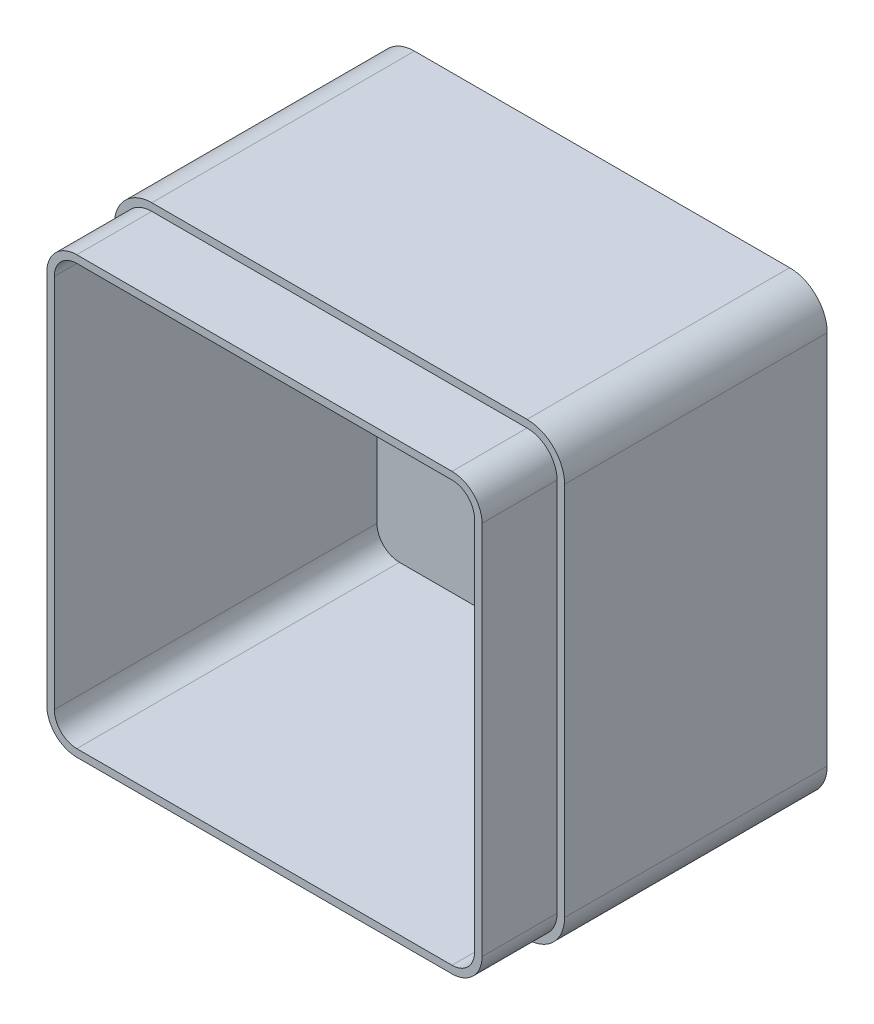
ISO-10303-21;
HEADER;
FILE_DESCRIPTION(('STEP AP214'),'2;1');
FILE_NAME('part.step','',(''),(''),'','','');
FILE_SCHEMA(('AUTOMOTIVE_DESIGN { 1 0 10303 214 1 1 1 1 }'));
ENDSEC;
DATA;
#1=APPLICATION_CONTEXT('core data for automotive mechanical design processes');
#2=APPLICATION_PROTOCOL_DEFINITION('international standard','automotive_design',2000,#1);
#3=PRODUCT_CONTEXT('',#1,'mechanical');
#4=PRODUCT('Part','Part','',(#3));
#5=PRODUCT_RELATED_PRODUCT_CATEGORY('part','',(#4));
#6=PRODUCT_DEFINITION_FORMATION('','',#4);
#7=PRODUCT_DEFINITION_CONTEXT('part definition',#1,'design');
#8=PRODUCT_DEFINITION('design','',#6,#7);
#9=PRODUCT_DEFINITION_SHAPE('','',#8);
#10=(LENGTH_UNIT() NAMED_UNIT(*) SI_UNIT(.MILLI.,.METRE.));
#11=(NAMED_UNIT(*) PLANE_ANGLE_UNIT() SI_UNIT($,.RADIAN.));
#12=(NAMED_UNIT(*) SI_UNIT($,.STERADIAN.) SOLID_ANGLE_UNIT());
#13=UNCERTAINTY_MEASURE_WITH_UNIT(LENGTH_MEASURE(1.E-05),#10,'distance_accuracy_value','');
#14=(GEOMETRIC_REPRESENTATION_CONTEXT(3) GLOBAL_UNCERTAINTY_ASSIGNED_CONTEXT((#13)) GLOBAL_UNIT_ASSIGNED_CONTEXT((#10,
#11,#12)) REPRESENTATION_CONTEXT('',''));
#15=CARTESIAN_POINT('',(0.,0.,0.));
#16=DIRECTION('',(0.,0.,1.));
#17=DIRECTION('',(1.,0.,0.));
#18=AXIS2_PLACEMENT_3D('',#15,#16,#17);
#19=CARTESIAN_POINT('',(0.,0.,90.));
#20=DIRECTION('',(0.,0.,1.));
#21=DIRECTION('',(1.,0.,0.));
#22=AXIS2_PLACEMENT_3D('',#19,#20,#21);
#23=PLANE('',#22);
#24=DIRECTION('',(0.,-1.,0.));
#25=VECTOR('',#24,1.);
#26=CARTESIAN_POINT('',(4.,0.,90.));
#27=LINE('',#26,#25);
#28=CARTESIAN_POINT('',(4.,-9.99999999999999,90.));
#29=VERTEX_POINT('',#28);
#30=CARTESIAN_POINT('',(4.,-110.,90.));
#31=VERTEX_POINT('',#30);
#32=EDGE_CURVE('E398',#29,#31,#27,.T.);
#33=ORIENTED_EDGE('',*,*,#32,.F.);
#34=CARTESIAN_POINT('',(10.,-10.,90.));
#35=DIRECTION('',(0.,0.,1.));
#36=DIRECTION('',(1.,0.,0.));
#37=AXIS2_PLACEMENT_3D('',#34,#35,#36);
#38=CIRCLE('',#37,6.);
#39=CARTESIAN_POINT('',(9.99999999999999,-4.,90.));
#40=VERTEX_POINT('',#39);
#41=EDGE_CURVE('E444',#40,#29,#38,.T.);
#42=ORIENTED_EDGE('',*,*,#41,.F.);
#43=DIRECTION('',(-1.,0.,0.));
#44=VECTOR('',#43,1.);
#45=CARTESIAN_POINT('',(0.,-4.,90.));
#46=LINE('',#45,#44);
#47=CARTESIAN_POINT('',(110.,-4.,90.));
#48=VERTEX_POINT('',#47);
#49=EDGE_CURVE('E413',#48,#40,#46,.T.);
#50=ORIENTED_EDGE('',*,*,#49,.F.);
#51=CARTESIAN_POINT('',(110.,-10.,90.));
#52=DIRECTION('',(0.,0.,1.));
#53=DIRECTION('',(1.,0.,0.));
#54=AXIS2_PLACEMENT_3D('',#51,#52,#53);
#55=CIRCLE('',#54,6.);
#56=CARTESIAN_POINT('',(116.,-10.,90.));
#57=VERTEX_POINT('',#56);
#58=EDGE_CURVE('E377',#57,#48,#55,.T.);
#59=ORIENTED_EDGE('',*,*,#58,.F.);
#60=DIRECTION('',(0.,1.,0.));
#61=VECTOR('',#60,1.);
#62=CARTESIAN_POINT('',(116.,0.,90.));
#63=LINE('',#62,#61);
#64=CARTESIAN_POINT('',(116.,-110.,90.));
#65=VERTEX_POINT('',#64);
#66=EDGE_CURVE('E441',#65,#57,#63,.T.);
#67=ORIENTED_EDGE('',*,*,#66,.F.);
#68=CARTESIAN_POINT('',(110.,-110.,90.));
#69=DIRECTION('',(0.,0.,1.));
#70=DIRECTION('',(1.,0.,0.));
#71=AXIS2_PLACEMENT_3D('',#68,#69,#70);
#72=CIRCLE('',#71,6.);
#73=CARTESIAN_POINT('',(110.,-116.,90.));
#74=VERTEX_POINT('',#73);
#75=EDGE_CURVE('E437',#74,#65,#72,.T.);
#76=ORIENTED_EDGE('',*,*,#75,.F.);
#77=DIRECTION('',(1.,0.,0.));
#78=VECTOR('',#77,1.);
#79=CARTESIAN_POINT('',(0.,-116.,90.));
#80=LINE('',#79,#78);
#81=CARTESIAN_POINT('',(9.99999999999999,-116.,90.));
#82=VERTEX_POINT('',#81);
#83=EDGE_CURVE('E434',#82,#74,#80,.T.);
#84=ORIENTED_EDGE('',*,*,#83,.F.);
#85=CARTESIAN_POINT('',(10.,-110.,90.));
#86=DIRECTION('',(0.,0.,1.));
#87=DIRECTION('',(1.,0.,0.));
#88=AXIS2_PLACEMENT_3D('',#85,#86,#87);
#89=CIRCLE('',#88,6.);
#90=EDGE_CURVE('E422',#31,#82,#89,.T.);
#91=ORIENTED_EDGE('',*,*,#90,.F.);
#92=EDGE_LOOP('',(#33,#42,#50,#59,#67,#76,#84,#91));
#93=FACE_BOUND('',#92,.T.);
#94=DIRECTION('',(-1.,0.,0.));
#95=VECTOR('',#94,1.);
#96=CARTESIAN_POINT('',(110.,-2.,90.));
#97=LINE('',#96,#95);
#98=CARTESIAN_POINT('',(110.,-2.,90.));
#99=VERTEX_POINT('',#98);
#100=CARTESIAN_POINT('',(9.99999999999999,-2.,90.));
#101=VERTEX_POINT('',#100);
#102=EDGE_CURVE('E278',#99,#101,#97,.T.);
#103=ORIENTED_EDGE('',*,*,#102,.T.);
#104=CARTESIAN_POINT('',(10.,-10.,90.));
#105=DIRECTION('',(0.,0.,1.));
#106=DIRECTION('',(1.,0.,0.));
#107=AXIS2_PLACEMENT_3D('',#104,#105,#106);
#108=CIRCLE('',#107,8.);
#109=CARTESIAN_POINT('',(2.,-9.99999999999999,90.));
#110=VERTEX_POINT('',#109);
#111=EDGE_CURVE('E305',#101,#110,#108,.T.);
#112=ORIENTED_EDGE('',*,*,#111,.T.);
#113=DIRECTION('',(0.,-1.,0.));
#114=VECTOR('',#113,1.);
#115=CARTESIAN_POINT('',(2.,-9.99999999999999,90.));
#116=LINE('',#115,#114);
#117=CARTESIAN_POINT('',(2.,-110.,90.));
#118=VERTEX_POINT('',#117);
#119=EDGE_CURVE('E255',#110,#118,#116,.T.);
#120=ORIENTED_EDGE('',*,*,#119,.T.);
#121=CARTESIAN_POINT('',(10.,-110.,90.));
#122=DIRECTION('',(0.,0.,1.));
#123=DIRECTION('',(1.,0.,0.));
#124=AXIS2_PLACEMENT_3D('',#121,#122,#123);
#125=CIRCLE('',#124,7.99999999999999);
#126=CARTESIAN_POINT('',(9.99999999999999,-118.,90.));
#127=VERTEX_POINT('',#126);
#128=EDGE_CURVE('E103',#118,#127,#125,.T.);
#129=ORIENTED_EDGE('',*,*,#128,.T.);
#130=DIRECTION('',(1.,0.,0.));
#131=VECTOR('',#130,1.);
#132=CARTESIAN_POINT('',(9.99999999999999,-118.,90.));
#133=LINE('',#132,#131);
#134=CARTESIAN_POINT('',(110.,-118.,90.));
#135=VERTEX_POINT('',#134);
#136=EDGE_CURVE('E312',#127,#135,#133,.T.);
#137=ORIENTED_EDGE('',*,*,#136,.T.);
#138=CARTESIAN_POINT('',(110.,-110.,90.));
#139=DIRECTION('',(0.,0.,1.));
#140=DIRECTION('',(1.,0.,0.));
#141=AXIS2_PLACEMENT_3D('',#138,#139,#140);
#142=CIRCLE('',#141,7.99999999999999);
#143=CARTESIAN_POINT('',(118.,-110.,90.));
#144=VERTEX_POINT('',#143);
#145=EDGE_CURVE('E316',#135,#144,#142,.T.);
#146=ORIENTED_EDGE('',*,*,#145,.T.);
#147=DIRECTION('',(0.,1.,0.));
#148=VECTOR('',#147,1.);
#149=CARTESIAN_POINT('',(118.,-110.,90.));
#150=LINE('',#149,#148);
#151=CARTESIAN_POINT('',(118.,-9.99999999999999,90.));
#152=VERTEX_POINT('',#151);
#153=EDGE_CURVE('E320',#144,#152,#150,.T.);
#154=ORIENTED_EDGE('',*,*,#153,.T.);
#155=CARTESIAN_POINT('',(110.,-10.,90.));
#156=DIRECTION('',(0.,0.,1.));
#157=DIRECTION('',(1.,0.,0.));
#158=AXIS2_PLACEMENT_3D('',#155,#156,#157);
#159=CIRCLE('',#158,8.);
#160=EDGE_CURVE('E282',#152,#99,#159,.T.);
#161=ORIENTED_EDGE('',*,*,#160,.T.);
#162=EDGE_LOOP('',(#103,#112,#120,#129,#137,#146,#154,#161));
#163=FACE_BOUND('',#162,.T.);
#164=ADVANCED_FACE('F87',(#93,#163),#23,.T.);
#165=CARTESIAN_POINT('',(4.,0.,90.));
#166=DIRECTION('',(1.,0.,0.));
#167=DIRECTION('',(0.,0.,-1.));
#168=AXIS2_PLACEMENT_3D('',#165,#166,#167);
#169=PLANE('',#168);
#170=DIRECTION('',(0.,-1.,0.));
#171=VECTOR('',#170,1.);
#172=CARTESIAN_POINT('',(4.,0.,4.));
#173=LINE('',#172,#171);
#174=CARTESIAN_POINT('',(4.,-9.99999999999999,4.));
#175=VERTEX_POINT('',#174);
#176=CARTESIAN_POINT('',(4.,-110.,4.));
#177=VERTEX_POINT('',#176);
#178=EDGE_CURVE('E369',#175,#177,#173,.T.);
#179=ORIENTED_EDGE('',*,*,#178,.F.);
#180=DIRECTION('',(0.,0.,-1.));
#181=VECTOR('',#180,1.);
#182=CARTESIAN_POINT('',(4.,-9.99999999999999,90.));
#183=LINE('',#182,#181);
#184=EDGE_CURVE('E378',#29,#175,#183,.T.);
#185=ORIENTED_EDGE('',*,*,#184,.F.);
#186=ORIENTED_EDGE('',*,*,#32,.T.);
#187=DIRECTION('',(0.,0.,-1.));
#188=VECTOR('',#187,1.);
#189=CARTESIAN_POINT('',(4.,-110.,90.));
#190=LINE('',#189,#188);
#191=EDGE_CURVE('E374',#177,#31,#190,.F.);
#192=ORIENTED_EDGE('',*,*,#191,.F.);
#193=EDGE_LOOP('',(#179,#185,#186,#192));
#194=FACE_BOUND('',#193,.T.);
#195=ADVANCED_FACE('F552',(#194),#169,.T.);
#196=CARTESIAN_POINT('',(0.,-116.,90.));
#197=DIRECTION('',(0.,1.,0.));
#198=DIRECTION('',(-1.,0.,0.));
#199=AXIS2_PLACEMENT_3D('',#196,#197,#198);
#200=PLANE('',#199);
#201=ORIENTED_EDGE('',*,*,#83,.T.);
#202=DIRECTION('',(0.,0.,1.));
#203=VECTOR('',#202,1.);
#204=CARTESIAN_POINT('',(110.,-116.,90.));
#205=LINE('',#204,#203);
#206=CARTESIAN_POINT('',(110.,-116.,4.));
#207=VERTEX_POINT('',#206);
#208=EDGE_CURVE('E410',#207,#74,#205,.T.);
#209=ORIENTED_EDGE('',*,*,#208,.F.);
#210=DIRECTION('',(1.,0.,0.));
#211=VECTOR('',#210,1.);
#212=CARTESIAN_POINT('',(0.,-116.,4.));
#213=LINE('',#212,#211);
#214=CARTESIAN_POINT('',(9.99999999999999,-116.,4.));
#215=VERTEX_POINT('',#214);
#216=EDGE_CURVE('E373',#215,#207,#213,.T.);
#217=ORIENTED_EDGE('',*,*,#216,.F.);
#218=DIRECTION('',(0.,0.,1.));
#219=VECTOR('',#218,1.);
#220=CARTESIAN_POINT('',(9.99999999999999,-116.,90.));
#221=LINE('',#220,#219);
#222=EDGE_CURVE('E401',#82,#215,#221,.F.);
#223=ORIENTED_EDGE('',*,*,#222,.F.);
#224=EDGE_LOOP('',(#201,#209,#217,#223));
#225=FACE_BOUND('',#224,.T.);
#226=ADVANCED_FACE('F558',(#225),#200,.T.);
#227=CARTESIAN_POINT('',(116.,0.,90.));
#228=DIRECTION('',(-1.,0.,0.));
#229=DIRECTION('',(0.,-1.,0.));
#230=AXIS2_PLACEMENT_3D('',#227,#228,#229);
#231=PLANE('',#230);
#232=ORIENTED_EDGE('',*,*,#66,.T.);
#233=DIRECTION('',(0.,0.,1.));
#234=VECTOR('',#233,1.);
#235=CARTESIAN_POINT('',(116.,-10.,90.));
#236=LINE('',#235,#234);
#237=CARTESIAN_POINT('',(116.,-10.,4.));
#238=VERTEX_POINT('',#237);
#239=EDGE_CURVE('E419',#238,#57,#236,.T.);
#240=ORIENTED_EDGE('',*,*,#239,.F.);
#241=DIRECTION('',(0.,1.,0.));
#242=VECTOR('',#241,1.);
#243=CARTESIAN_POINT('',(116.,0.,4.));
#244=LINE('',#243,#242);
#245=CARTESIAN_POINT('',(116.,-110.,4.));
#246=VERTEX_POINT('',#245);
#247=EDGE_CURVE('E386',#246,#238,#244,.T.);
#248=ORIENTED_EDGE('',*,*,#247,.F.);
#249=DIRECTION('',(0.,0.,1.));
#250=VECTOR('',#249,1.);
#251=CARTESIAN_POINT('',(116.,-110.,90.));
#252=LINE('',#251,#250);
#253=EDGE_CURVE('E414',#65,#246,#252,.F.);
#254=ORIENTED_EDGE('',*,*,#253,.F.);
#255=EDGE_LOOP('',(#232,#240,#248,#254));
#256=FACE_BOUND('',#255,.T.);
#257=ADVANCED_FACE('F752',(#256),#231,.T.);
#258=CARTESIAN_POINT('',(0.,-4.,90.));
#259=DIRECTION('',(0.,-1.,0.));
#260=DIRECTION('',(0.,0.,-1.));
#261=AXIS2_PLACEMENT_3D('',#258,#259,#260);
#262=PLANE('',#261);
#263=DIRECTION('',(-1.,0.,0.));
#264=VECTOR('',#263,1.);
#265=CARTESIAN_POINT('',(0.,-4.,4.));
#266=LINE('',#265,#264);
#267=CARTESIAN_POINT('',(110.,-4.,4.));
#268=VERTEX_POINT('',#267);
#269=CARTESIAN_POINT('',(9.99999999999999,-4.,4.));
#270=VERTEX_POINT('',#269);
#271=EDGE_CURVE('E394',#268,#270,#266,.T.);
#272=ORIENTED_EDGE('',*,*,#271,.F.);
#273=DIRECTION('',(0.,0.,-1.));
#274=VECTOR('',#273,1.);
#275=CARTESIAN_POINT('',(110.,-4.,90.));
#276=LINE('',#275,#274);
#277=EDGE_CURVE('E418',#48,#268,#276,.T.);
#278=ORIENTED_EDGE('',*,*,#277,.F.);
#279=ORIENTED_EDGE('',*,*,#49,.T.);
#280=DIRECTION('',(0.,0.,-1.));
#281=VECTOR('',#280,1.);
#282=CARTESIAN_POINT('',(9.99999999999999,-4.,90.));
#283=LINE('',#282,#281);
#284=EDGE_CURVE('E426',#270,#40,#283,.F.);
#285=ORIENTED_EDGE('',*,*,#284,.F.);
#286=EDGE_LOOP('',(#272,#278,#279,#285));
#287=FACE_BOUND('',#286,.T.);
#288=ADVANCED_FACE('F742',(#287),#262,.T.);
#289=CARTESIAN_POINT('',(0.,0.,4.));
#290=DIRECTION('',(0.,0.,1.));
#291=DIRECTION('',(1.,0.,0.));
#292=AXIS2_PLACEMENT_3D('',#289,#290,#291);
#293=PLANE('',#292);
#294=ORIENTED_EDGE('',*,*,#216,.T.);
#295=CARTESIAN_POINT('',(110.,-110.,4.));
#296=DIRECTION('',(0.,0.,1.));
#297=DIRECTION('',(1.,0.,0.));
#298=AXIS2_PLACEMENT_3D('',#295,#296,#297);
#299=CIRCLE('',#298,6.);
#300=EDGE_CURVE('E389',#246,#207,#299,.F.);
#301=ORIENTED_EDGE('',*,*,#300,.F.);
#302=ORIENTED_EDGE('',*,*,#247,.T.);
#303=CARTESIAN_POINT('',(110.,-10.,4.));
#304=DIRECTION('',(0.,0.,1.));
#305=DIRECTION('',(1.,0.,0.));
#306=AXIS2_PLACEMENT_3D('',#303,#304,#305);
#307=CIRCLE('',#306,6.);
#308=EDGE_CURVE('E393',#268,#238,#307,.F.);
#309=ORIENTED_EDGE('',*,*,#308,.F.);
#310=ORIENTED_EDGE('',*,*,#271,.T.);
#311=CARTESIAN_POINT('',(10.,-10.,4.));
#312=DIRECTION('',(0.,0.,1.));
#313=DIRECTION('',(1.,0.,0.));
#314=AXIS2_PLACEMENT_3D('',#311,#312,#313);
#315=CIRCLE('',#314,6.);
#316=EDGE_CURVE('E390',#175,#270,#315,.F.);
#317=ORIENTED_EDGE('',*,*,#316,.F.);
#318=ORIENTED_EDGE('',*,*,#178,.T.);
#319=CARTESIAN_POINT('',(10.,-110.,4.));
#320=DIRECTION('',(0.,0.,1.));
#321=DIRECTION('',(1.,0.,0.));
#322=AXIS2_PLACEMENT_3D('',#319,#320,#321);
#323=CIRCLE('',#322,6.);
#324=EDGE_CURVE('E382',#215,#177,#323,.F.);
#325=ORIENTED_EDGE('',*,*,#324,.F.);
#326=EDGE_LOOP('',(#294,#301,#302,#309,#310,#317,#318,#325));
#327=FACE_BOUND('',#326,.T.);
#328=ADVANCED_FACE('F732',(#327),#293,.T.);
#329=CARTESIAN_POINT('',(10.,-110.,90.));
#330=DIRECTION('',(0.,0.,-1.));
#331=DIRECTION('',(-1.,0.,0.));
#332=AXIS2_PLACEMENT_3D('',#329,#330,#331);
#333=CYLINDRICAL_SURFACE('',#332,6.);
#334=ORIENTED_EDGE('',*,*,#90,.T.);
#335=ORIENTED_EDGE('',*,*,#222,.T.);
#336=ORIENTED_EDGE('',*,*,#324,.T.);
#337=ORIENTED_EDGE('',*,*,#191,.T.);
#338=EDGE_LOOP('',(#334,#335,#336,#337));
#339=FACE_BOUND('',#338,.T.);
#340=ADVANCED_FACE('F722',(#339),#333,.F.);
#341=CARTESIAN_POINT('',(110.,-110.,90.));
#342=DIRECTION('',(0.,0.,-1.));
#343=DIRECTION('',(-1.,0.,0.));
#344=AXIS2_PLACEMENT_3D('',#341,#342,#343);
#345=CYLINDRICAL_SURFACE('',#344,6.);
#346=ORIENTED_EDGE('',*,*,#75,.T.);
#347=ORIENTED_EDGE('',*,*,#253,.T.);
#348=ORIENTED_EDGE('',*,*,#300,.T.);
#349=ORIENTED_EDGE('',*,*,#208,.T.);
#350=EDGE_LOOP('',(#346,#347,#348,#349));
#351=FACE_BOUND('',#350,.T.);
#352=ADVANCED_FACE('F713',(#351),#345,.F.);
#353=CARTESIAN_POINT('',(10.,-10.,90.));
#354=DIRECTION('',(0.,0.,-1.));
#355=DIRECTION('',(-1.,0.,0.));
#356=AXIS2_PLACEMENT_3D('',#353,#354,#355);
#357=CYLINDRICAL_SURFACE('',#356,6.);
#358=ORIENTED_EDGE('',*,*,#41,.T.);
#359=ORIENTED_EDGE('',*,*,#184,.T.);
#360=ORIENTED_EDGE('',*,*,#316,.T.);
#361=ORIENTED_EDGE('',*,*,#284,.T.);
#362=EDGE_LOOP('',(#358,#359,#360,#361));
#363=FACE_BOUND('',#362,.T.);
#364=ADVANCED_FACE('F704',(#363),#357,.F.);
#365=CARTESIAN_POINT('',(110.,-10.,90.));
#366=DIRECTION('',(0.,0.,-1.));
#367=DIRECTION('',(-1.,0.,0.));
#368=AXIS2_PLACEMENT_3D('',#365,#366,#367);
#369=CYLINDRICAL_SURFACE('',#368,6.);
#370=ORIENTED_EDGE('',*,*,#58,.T.);
#371=ORIENTED_EDGE('',*,*,#277,.T.);
#372=ORIENTED_EDGE('',*,*,#308,.T.);
#373=ORIENTED_EDGE('',*,*,#239,.T.);
#374=EDGE_LOOP('',(#370,#371,#372,#373));
#375=FACE_BOUND('',#374,.T.);
#376=ADVANCED_FACE('F565',(#375),#369,.F.);
#377=CARTESIAN_POINT('',(10.,-10.,70.));
#378=DIRECTION('',(0.,0.,1.));
#379=DIRECTION('',(1.,0.,0.));
#380=AXIS2_PLACEMENT_3D('',#377,#378,#379);
#381=PLANE('',#380);
#382=DIRECTION('',(-1.,0.,0.));
#383=VECTOR('',#382,1.);
#384=CARTESIAN_POINT('',(110.,-2.,70.));
#385=LINE('',#384,#383);
#386=CARTESIAN_POINT('',(110.,-2.,70.));
#387=VERTEX_POINT('',#386);
#388=CARTESIAN_POINT('',(9.99999999999999,-2.,70.));
#389=VERTEX_POINT('',#388);
#390=EDGE_CURVE('E262',#387,#389,#385,.T.);
#391=ORIENTED_EDGE('',*,*,#390,.F.);
#392=CARTESIAN_POINT('',(110.,-10.,70.));
#393=DIRECTION('',(0.,0.,1.));
#394=DIRECTION('',(1.,0.,0.));
#395=AXIS2_PLACEMENT_3D('',#392,#393,#394);
#396=CIRCLE('',#395,8.);
#397=CARTESIAN_POINT('',(118.,-9.99999999999999,70.));
#398=VERTEX_POINT('',#397);
#399=EDGE_CURVE('E299',#398,#387,#396,.T.);
#400=ORIENTED_EDGE('',*,*,#399,.F.);
#401=DIRECTION('',(0.,1.,0.));
#402=VECTOR('',#401,1.);
#403=CARTESIAN_POINT('',(118.,-110.,70.));
#404=LINE('',#403,#402);
#405=CARTESIAN_POINT('',(118.,-110.,70.));
#406=VERTEX_POINT('',#405);
#407=EDGE_CURVE('E295',#406,#398,#404,.T.);
#408=ORIENTED_EDGE('',*,*,#407,.F.);
#409=CARTESIAN_POINT('',(110.,-110.,70.));
#410=DIRECTION('',(0.,0.,1.));
#411=DIRECTION('',(1.,0.,0.));
#412=AXIS2_PLACEMENT_3D('',#409,#410,#411);
#413=CIRCLE('',#412,7.99999999999999);
#414=CARTESIAN_POINT('',(110.,-118.,70.));
#415=VERTEX_POINT('',#414);
#416=EDGE_CURVE('E291',#415,#406,#413,.T.);
#417=ORIENTED_EDGE('',*,*,#416,.F.);
#418=DIRECTION('',(1.,0.,0.));
#419=VECTOR('',#418,1.);
#420=CARTESIAN_POINT('',(9.99999999999999,-118.,70.));
#421=LINE('',#420,#419);
#422=CARTESIAN_POINT('',(9.99999999999999,-118.,70.));
#423=VERTEX_POINT('',#422);
#424=EDGE_CURVE('E287',#423,#415,#421,.T.);
#425=ORIENTED_EDGE('',*,*,#424,.F.);
#426=CARTESIAN_POINT('',(10.,-110.,70.));
#427=DIRECTION('',(0.,0.,1.));
#428=DIRECTION('',(1.,0.,0.));
#429=AXIS2_PLACEMENT_3D('',#426,#427,#428);
#430=CIRCLE('',#429,7.99999999999999);
#431=CARTESIAN_POINT('',(2.,-110.,70.));
#432=VERTEX_POINT('',#431);
#433=EDGE_CURVE('E272',#432,#423,#430,.T.);
#434=ORIENTED_EDGE('',*,*,#433,.F.);
#435=DIRECTION('',(0.,-1.,0.));
#436=VECTOR('',#435,1.);
#437=CARTESIAN_POINT('',(2.,-9.99999999999999,70.));
#438=LINE('',#437,#436);
#439=CARTESIAN_POINT('',(2.,-9.99999999999999,70.));
#440=VERTEX_POINT('',#439);
#441=EDGE_CURVE('E253',#440,#432,#438,.T.);
#442=ORIENTED_EDGE('',*,*,#441,.F.);
#443=CARTESIAN_POINT('',(10.,-10.,70.));
#444=DIRECTION('',(0.,0.,1.));
#445=DIRECTION('',(1.,0.,0.));
#446=AXIS2_PLACEMENT_3D('',#443,#444,#445);
#447=CIRCLE('',#446,8.);
#448=EDGE_CURVE('E268',#389,#440,#447,.T.);
#449=ORIENTED_EDGE('',*,*,#448,.F.);
#450=EDGE_LOOP('',(#391,#400,#408,#417,#425,#434,#442,#449));
#451=FACE_BOUND('',#450,.T.);
#452=CARTESIAN_POINT('',(10.,-10.,70.));
#453=DIRECTION('',(0.,0.,1.));
#454=DIRECTION('',(1.,0.,0.));
#455=AXIS2_PLACEMENT_3D('',#452,#453,#454);
#456=CIRCLE('',#455,10.);
#457=CARTESIAN_POINT('',(10.,0.,70.));
#458=VERTEX_POINT('',#457);
#459=CARTESIAN_POINT('',(0.,-9.99999999999999,70.));
#460=VERTEX_POINT('',#459);
#461=EDGE_CURVE('E329',#458,#460,#456,.T.);
#462=ORIENTED_EDGE('',*,*,#461,.T.);
#463=DIRECTION('',(0.,-1.,0.));
#464=VECTOR('',#463,1.);
#465=CARTESIAN_POINT('',(0.,-9.99999999999999,70.));
#466=LINE('',#465,#464);
#467=CARTESIAN_POINT('',(0.,-110.,70.));
#468=VERTEX_POINT('',#467);
#469=EDGE_CURVE('E349',#460,#468,#466,.T.);
#470=ORIENTED_EDGE('',*,*,#469,.T.);
#471=CARTESIAN_POINT('',(10.,-110.,70.));
#472=DIRECTION('',(0.,0.,1.));
#473=DIRECTION('',(1.,0.,0.));
#474=AXIS2_PLACEMENT_3D('',#471,#472,#473);
#475=CIRCLE('',#474,9.99999999999999);
#476=CARTESIAN_POINT('',(9.99999999999999,-120.,70.));
#477=VERTEX_POINT('',#476);
#478=EDGE_CURVE('E352',#468,#477,#475,.T.);
#479=ORIENTED_EDGE('',*,*,#478,.T.);
#480=DIRECTION('',(1.,0.,0.));
#481=VECTOR('',#480,1.);
#482=CARTESIAN_POINT('',(9.99999999999999,-120.,70.));
#483=LINE('',#482,#481);
#484=CARTESIAN_POINT('',(110.,-120.,70.));
#485=VERTEX_POINT('',#484);
#486=EDGE_CURVE('E355',#477,#485,#483,.T.);
#487=ORIENTED_EDGE('',*,*,#486,.T.);
#488=CARTESIAN_POINT('',(110.,-110.,70.));
#489=DIRECTION('',(0.,0.,1.));
#490=DIRECTION('',(1.,0.,0.));
#491=AXIS2_PLACEMENT_3D('',#488,#489,#490);
#492=CIRCLE('',#491,9.99999999999999);
#493=CARTESIAN_POINT('',(120.,-110.,70.));
#494=VERTEX_POINT('',#493);
#495=EDGE_CURVE('E358',#485,#494,#492,.T.);
#496=ORIENTED_EDGE('',*,*,#495,.T.);
#497=DIRECTION('',(0.,1.,0.));
#498=VECTOR('',#497,1.);
#499=CARTESIAN_POINT('',(120.,-110.,70.));
#500=LINE('',#499,#498);
#501=CARTESIAN_POINT('',(120.,-10.,70.));
#502=VERTEX_POINT('',#501);
#503=EDGE_CURVE('E111',#494,#502,#500,.T.);
#504=ORIENTED_EDGE('',*,*,#503,.T.);
#505=CARTESIAN_POINT('',(110.,-10.,70.));
#506=DIRECTION('',(0.,0.,1.));
#507=DIRECTION('',(1.,0.,0.));
#508=AXIS2_PLACEMENT_3D('',#505,#506,#507);
#509=CIRCLE('',#508,9.99999999999999);
#510=CARTESIAN_POINT('',(110.,0.,70.));
#511=VERTEX_POINT('',#510);
#512=EDGE_CURVE('E363',#502,#511,#509,.T.);
#513=ORIENTED_EDGE('',*,*,#512,.T.);
#514=DIRECTION('',(-1.,0.,0.));
#515=VECTOR('',#514,1.);
#516=CARTESIAN_POINT('',(110.,0.,70.));
#517=LINE('',#516,#515);
#518=EDGE_CURVE('E366',#511,#458,#517,.T.);
#519=ORIENTED_EDGE('',*,*,#518,.T.);
#520=EDGE_LOOP('',(#462,#470,#479,#487,#496,#504,#513,#519));
#521=FACE_BOUND('',#520,.T.);
#522=ADVANCED_FACE('F267',(#451,#521),#381,.T.);
#523=CARTESIAN_POINT('',(10.,-10.,70.));
#524=DIRECTION('',(0.,0.,1.));
#525=DIRECTION('',(1.,0.,0.));
#526=AXIS2_PLACEMENT_3D('',#523,#524,#525);
#527=CYLINDRICAL_SURFACE('',#526,8.);
#528=ORIENTED_EDGE('',*,*,#111,.F.);
#529=DIRECTION('',(0.,0.,1.));
#530=VECTOR('',#529,1.);
#531=CARTESIAN_POINT('',(9.99999999999999,-2.,70.));
#532=LINE('',#531,#530);
#533=EDGE_CURVE('E276',#389,#101,#532,.T.);
#534=ORIENTED_EDGE('',*,*,#533,.F.);
#535=ORIENTED_EDGE('',*,*,#448,.T.);
#536=DIRECTION('',(0.,0.,1.));
#537=VECTOR('',#536,1.);
#538=CARTESIAN_POINT('',(2.,-9.99999999999999,70.));
#539=LINE('',#538,#537);
#540=EDGE_CURVE('E250',#440,#110,#539,.T.);
#541=ORIENTED_EDGE('',*,*,#540,.T.);
#542=EDGE_LOOP('',(#528,#534,#535,#541));
#543=FACE_BOUND('',#542,.T.);
#544=ADVANCED_FACE('F275',(#543),#527,.T.);
#545=CARTESIAN_POINT('',(110.,-2.,70.));
#546=DIRECTION('',(0.,1.,0.));
#547=DIRECTION('',(-1.,0.,0.));
#548=AXIS2_PLACEMENT_3D('',#545,#546,#547);
#549=PLANE('',#548);
#550=ORIENTED_EDGE('',*,*,#102,.F.);
#551=DIRECTION('',(0.,0.,1.));
#552=VECTOR('',#551,1.);
#553=CARTESIAN_POINT('',(110.,-2.,70.));
#554=LINE('',#553,#552);
#555=EDGE_CURVE('E330',#387,#99,#554,.T.);
#556=ORIENTED_EDGE('',*,*,#555,.F.);
#557=ORIENTED_EDGE('',*,*,#390,.T.);
#558=ORIENTED_EDGE('',*,*,#533,.T.);
#559=EDGE_LOOP('',(#550,#556,#557,#558));
#560=FACE_BOUND('',#559,.T.);
#561=ADVANCED_FACE('F608',(#560),#549,.T.);
#562=CARTESIAN_POINT('',(110.,-10.,70.));
#563=DIRECTION('',(0.,0.,1.));
#564=DIRECTION('',(1.,0.,0.));
#565=AXIS2_PLACEMENT_3D('',#562,#563,#564);
#566=CYLINDRICAL_SURFACE('',#565,8.);
#567=ORIENTED_EDGE('',*,*,#160,.F.);
#568=DIRECTION('',(0.,0.,1.));
#569=VECTOR('',#568,1.);
#570=CARTESIAN_POINT('',(118.,-9.99999999999999,70.));
#571=LINE('',#570,#569);
#572=EDGE_CURVE('E333',#398,#152,#571,.T.);
#573=ORIENTED_EDGE('',*,*,#572,.F.);
#574=ORIENTED_EDGE('',*,*,#399,.T.);
#575=ORIENTED_EDGE('',*,*,#555,.T.);
#576=EDGE_LOOP('',(#567,#573,#574,#575));
#577=FACE_BOUND('',#576,.T.);
#578=ADVANCED_FACE('F616',(#577),#566,.T.);
#579=CARTESIAN_POINT('',(118.,-110.,70.));
#580=DIRECTION('',(1.,0.,0.));
#581=DIRECTION('',(0.,0.,-1.));
#582=AXIS2_PLACEMENT_3D('',#579,#580,#581);
#583=PLANE('',#582);
#584=ORIENTED_EDGE('',*,*,#153,.F.);
#585=DIRECTION('',(0.,0.,1.));
#586=VECTOR('',#585,1.);
#587=CARTESIAN_POINT('',(118.,-110.,70.));
#588=LINE('',#587,#586);
#589=EDGE_CURVE('E336',#406,#144,#588,.T.);
#590=ORIENTED_EDGE('',*,*,#589,.F.);
#591=ORIENTED_EDGE('',*,*,#407,.T.);
#592=ORIENTED_EDGE('',*,*,#572,.T.);
#593=EDGE_LOOP('',(#584,#590,#591,#592));
#594=FACE_BOUND('',#593,.T.);
#595=ADVANCED_FACE('F625',(#594),#583,.T.);
#596=CARTESIAN_POINT('',(110.,-110.,70.));
#597=DIRECTION('',(0.,0.,1.));
#598=DIRECTION('',(1.,0.,0.));
#599=AXIS2_PLACEMENT_3D('',#596,#597,#598);
#600=CYLINDRICAL_SURFACE('',#599,7.99999999999999);
#601=ORIENTED_EDGE('',*,*,#145,.F.);
#602=DIRECTION('',(0.,0.,1.));
#603=VECTOR('',#602,1.);
#604=CARTESIAN_POINT('',(110.,-118.,70.));
#605=LINE('',#604,#603);
#606=EDGE_CURVE('E339',#415,#135,#605,.T.);
#607=ORIENTED_EDGE('',*,*,#606,.F.);
#608=ORIENTED_EDGE('',*,*,#416,.T.);
#609=ORIENTED_EDGE('',*,*,#589,.T.);
#610=EDGE_LOOP('',(#601,#607,#608,#609));
#611=FACE_BOUND('',#610,.T.);
#612=ADVANCED_FACE('F634',(#611),#600,.T.);
#613=CARTESIAN_POINT('',(9.99999999999999,-118.,70.));
#614=DIRECTION('',(0.,-1.,0.));
#615=DIRECTION('',(0.,0.,-1.));
#616=AXIS2_PLACEMENT_3D('',#613,#614,#615);
#617=PLANE('',#616);
#618=ORIENTED_EDGE('',*,*,#136,.F.);
#619=DIRECTION('',(0.,0.,1.));
#620=VECTOR('',#619,1.);
#621=CARTESIAN_POINT('',(9.99999999999999,-118.,70.));
#622=LINE('',#621,#620);
#623=EDGE_CURVE('E342',#423,#127,#622,.T.);
#624=ORIENTED_EDGE('',*,*,#623,.F.);
#625=ORIENTED_EDGE('',*,*,#424,.T.);
#626=ORIENTED_EDGE('',*,*,#606,.T.);
#627=EDGE_LOOP('',(#618,#624,#625,#626));
#628=FACE_BOUND('',#627,.T.);
#629=ADVANCED_FACE('F643',(#628),#617,.T.);
#630=CARTESIAN_POINT('',(10.,-110.,70.));
#631=DIRECTION('',(0.,0.,1.));
#632=DIRECTION('',(1.,0.,0.));
#633=AXIS2_PLACEMENT_3D('',#630,#631,#632);
#634=CYLINDRICAL_SURFACE('',#633,7.99999999999999);
#635=ORIENTED_EDGE('',*,*,#128,.F.);
#636=DIRECTION('',(0.,0.,1.));
#637=VECTOR('',#636,1.);
#638=CARTESIAN_POINT('',(2.,-110.,70.));
#639=LINE('',#638,#637);
#640=EDGE_CURVE('E261',#432,#118,#639,.T.);
#641=ORIENTED_EDGE('',*,*,#640,.F.);
#642=ORIENTED_EDGE('',*,*,#433,.T.);
#643=ORIENTED_EDGE('',*,*,#623,.T.);
#644=EDGE_LOOP('',(#635,#641,#642,#643));
#645=FACE_BOUND('',#644,.T.);
#646=ADVANCED_FACE('F652',(#645),#634,.T.);
#647=CARTESIAN_POINT('',(2.,-9.99999999999999,70.));
#648=DIRECTION('',(-1.,0.,0.));
#649=DIRECTION('',(0.,0.,1.));
#650=AXIS2_PLACEMENT_3D('',#647,#648,#649);
#651=PLANE('',#650);
#652=ORIENTED_EDGE('',*,*,#119,.F.);
#653=ORIENTED_EDGE('',*,*,#540,.F.);
#654=ORIENTED_EDGE('',*,*,#441,.T.);
#655=ORIENTED_EDGE('',*,*,#640,.T.);
#656=EDGE_LOOP('',(#652,#653,#654,#655));
#657=FACE_BOUND('',#656,.T.);
#658=ADVANCED_FACE('F252',(#657),#651,.T.);
#659=CARTESIAN_POINT('',(0.,0.,0.));
#660=DIRECTION('',(0.,0.,1.));
#661=DIRECTION('',(1.,0.,0.));
#662=AXIS2_PLACEMENT_3D('',#659,#660,#661);
#663=PLANE('',#662);
#664=DIRECTION('',(1.,0.,0.));
#665=VECTOR('',#664,1.);
#666=CARTESIAN_POINT('',(0.,-120.,0.));
#667=LINE('',#666,#665);
#668=CARTESIAN_POINT('',(9.99999999999999,-120.,0.));
#669=VERTEX_POINT('',#668);
#670=CARTESIAN_POINT('',(110.,-120.,0.));
#671=VERTEX_POINT('',#670);
#672=EDGE_CURVE('E457',#669,#671,#667,.T.);
#673=ORIENTED_EDGE('',*,*,#672,.F.);
#674=CARTESIAN_POINT('',(10.,-110.,0.));
#675=DIRECTION('',(0.,0.,1.));
#676=DIRECTION('',(1.,0.,0.));
#677=AXIS2_PLACEMENT_3D('',#674,#675,#676);
#678=CIRCLE('',#677,10.);
#679=CARTESIAN_POINT('',(0.,-110.,0.));
#680=VERTEX_POINT('',#679);
#681=EDGE_CURVE('E485',#669,#680,#678,.F.);
#682=ORIENTED_EDGE('',*,*,#681,.T.);
#683=DIRECTION('',(0.,-1.,0.));
#684=VECTOR('',#683,1.);
#685=CARTESIAN_POINT('',(0.,0.,0.));
#686=LINE('',#685,#684);
#687=CARTESIAN_POINT('',(0.,-9.99999999999999,0.));
#688=VERTEX_POINT('',#687);
#689=EDGE_CURVE('E430',#688,#680,#686,.T.);
#690=ORIENTED_EDGE('',*,*,#689,.F.);
#691=CARTESIAN_POINT('',(10.,-10.,0.));
#692=DIRECTION('',(0.,0.,1.));
#693=DIRECTION('',(1.,0.,0.));
#694=AXIS2_PLACEMENT_3D('',#691,#692,#693);
#695=CIRCLE('',#694,10.);
#696=CARTESIAN_POINT('',(10.,0.,0.));
#697=VERTEX_POINT('',#696);
#698=EDGE_CURVE('E479',#688,#697,#695,.F.);
#699=ORIENTED_EDGE('',*,*,#698,.T.);
#700=DIRECTION('',(-1.,0.,0.));
#701=VECTOR('',#700,1.);
#702=CARTESIAN_POINT('',(0.,0.,0.));
#703=LINE('',#702,#701);
#704=CARTESIAN_POINT('',(110.,0.,0.));
#705=VERTEX_POINT('',#704);
#706=EDGE_CURVE('E465',#705,#697,#703,.T.);
#707=ORIENTED_EDGE('',*,*,#706,.F.);
#708=CARTESIAN_POINT('',(110.,-10.,0.));
#709=DIRECTION('',(0.,0.,1.));
#710=DIRECTION('',(1.,0.,0.));
#711=AXIS2_PLACEMENT_3D('',#708,#709,#710);
#712=CIRCLE('',#711,10.);
#713=CARTESIAN_POINT('',(120.,-10.,0.));
#714=VERTEX_POINT('',#713);
#715=EDGE_CURVE('E476',#705,#714,#712,.F.);
#716=ORIENTED_EDGE('',*,*,#715,.T.);
#717=DIRECTION('',(0.,1.,0.));
#718=VECTOR('',#717,1.);
#719=CARTESIAN_POINT('',(120.,0.,0.));
#720=LINE('',#719,#718);
#721=CARTESIAN_POINT('',(120.,-110.,0.));
#722=VERTEX_POINT('',#721);
#723=EDGE_CURVE('E461',#722,#714,#720,.T.);
#724=ORIENTED_EDGE('',*,*,#723,.F.);
#725=CARTESIAN_POINT('',(110.,-110.,0.));
#726=DIRECTION('',(0.,0.,1.));
#727=DIRECTION('',(1.,0.,0.));
#728=AXIS2_PLACEMENT_3D('',#725,#726,#727);
#729=CIRCLE('',#728,10.);
#730=EDGE_CURVE('E482',#722,#671,#729,.F.);
#731=ORIENTED_EDGE('',*,*,#730,.T.);
#732=EDGE_LOOP('',(#673,#682,#690,#699,#707,#716,#724,#731));
#733=FACE_BOUND('',#732,.T.);
#734=ADVANCED_FACE('F514',(#733),#663,.F.);
#735=CARTESIAN_POINT('',(10.,-10.,90.));
#736=DIRECTION('',(0.,0.,-1.));
#737=DIRECTION('',(-1.,0.,0.));
#738=AXIS2_PLACEMENT_3D('',#735,#736,#737);
#739=CYLINDRICAL_SURFACE('',#738,10.);
#740=DIRECTION('',(0.,0.,-1.));
#741=VECTOR('',#740,1.);
#742=CARTESIAN_POINT('',(0.,-10.,90.));
#743=LINE('',#742,#741);
#744=EDGE_CURVE('E488',#460,#688,#743,.T.);
#745=ORIENTED_EDGE('',*,*,#744,.F.);
#746=ORIENTED_EDGE('',*,*,#461,.F.);
#747=DIRECTION('',(0.,0.,-1.));
#748=VECTOR('',#747,1.);
#749=CARTESIAN_POINT('',(10.,0.,90.));
#750=LINE('',#749,#748);
#751=EDGE_CURVE('E12',#697,#458,#750,.F.);
#752=ORIENTED_EDGE('',*,*,#751,.F.);
#753=ORIENTED_EDGE('',*,*,#698,.F.);
#754=EDGE_LOOP('',(#745,#746,#752,#753));
#755=FACE_BOUND('',#754,.T.);
#756=ADVANCED_FACE('F519',(#755),#739,.T.);
#757=CARTESIAN_POINT('',(110.,-10.,90.));
#758=DIRECTION('',(0.,0.,-1.));
#759=DIRECTION('',(-1.,0.,0.));
#760=AXIS2_PLACEMENT_3D('',#757,#758,#759);
#761=CYLINDRICAL_SURFACE('',#760,10.);
#762=DIRECTION('',(0.,0.,-1.));
#763=VECTOR('',#762,1.);
#764=CARTESIAN_POINT('',(110.,0.,90.));
#765=LINE('',#764,#763);
#766=EDGE_CURVE('E96',#511,#705,#765,.T.);
#767=ORIENTED_EDGE('',*,*,#766,.F.);
#768=ORIENTED_EDGE('',*,*,#512,.F.);
#769=DIRECTION('',(0.,0.,-1.));
#770=VECTOR('',#769,1.);
#771=CARTESIAN_POINT('',(120.,-10.,90.));
#772=LINE('',#771,#770);
#773=EDGE_CURVE('E495',#714,#502,#772,.F.);
#774=ORIENTED_EDGE('',*,*,#773,.F.);
#775=ORIENTED_EDGE('',*,*,#715,.F.);
#776=EDGE_LOOP('',(#767,#768,#774,#775));
#777=FACE_BOUND('',#776,.T.);
#778=ADVANCED_FACE('F89',(#777),#761,.T.);
#779=CARTESIAN_POINT('',(0.,0.,90.));
#780=DIRECTION('',(0.,-1.,0.));
#781=DIRECTION('',(0.,0.,-1.));
#782=AXIS2_PLACEMENT_3D('',#779,#780,#781);
#783=PLANE('',#782);
#784=ORIENTED_EDGE('',*,*,#518,.F.);
#785=ORIENTED_EDGE('',*,*,#766,.T.);
#786=ORIENTED_EDGE('',*,*,#706,.T.);
#787=ORIENTED_EDGE('',*,*,#751,.T.);
#788=EDGE_LOOP('',(#784,#785,#786,#787));
#789=FACE_BOUND('',#788,.T.);
#790=ADVANCED_FACE('F506',(#789),#783,.F.);
#791=CARTESIAN_POINT('',(110.,-110.,90.));
#792=DIRECTION('',(0.,0.,-1.));
#793=DIRECTION('',(-1.,0.,0.));
#794=AXIS2_PLACEMENT_3D('',#791,#792,#793);
#795=CYLINDRICAL_SURFACE('',#794,10.);
#796=DIRECTION('',(0.,0.,-1.));
#797=VECTOR('',#796,1.);
#798=CARTESIAN_POINT('',(120.,-110.,90.));
#799=LINE('',#798,#797);
#800=EDGE_CURVE('E499',#494,#722,#799,.T.);
#801=ORIENTED_EDGE('',*,*,#800,.F.);
#802=ORIENTED_EDGE('',*,*,#495,.F.);
#803=DIRECTION('',(0.,0.,-1.));
#804=VECTOR('',#803,1.);
#805=CARTESIAN_POINT('',(110.,-120.,90.));
#806=LINE('',#805,#804);
#807=EDGE_CURVE('E469',#671,#485,#806,.F.);
#808=ORIENTED_EDGE('',*,*,#807,.F.);
#809=ORIENTED_EDGE('',*,*,#730,.F.);
#810=EDGE_LOOP('',(#801,#802,#808,#809));
#811=FACE_BOUND('',#810,.T.);
#812=ADVANCED_FACE('F538',(#811),#795,.T.);
#813=CARTESIAN_POINT('',(120.,0.,90.));
#814=DIRECTION('',(-1.,0.,0.));
#815=DIRECTION('',(0.,-1.,0.));
#816=AXIS2_PLACEMENT_3D('',#813,#814,#815);
#817=PLANE('',#816);
#818=ORIENTED_EDGE('',*,*,#503,.F.);
#819=ORIENTED_EDGE('',*,*,#800,.T.);
#820=ORIENTED_EDGE('',*,*,#723,.T.);
#821=ORIENTED_EDGE('',*,*,#773,.T.);
#822=EDGE_LOOP('',(#818,#819,#820,#821));
#823=FACE_BOUND('',#822,.T.);
#824=ADVANCED_FACE('F540',(#823),#817,.F.);
#825=CARTESIAN_POINT('',(10.,-110.,90.));
#826=DIRECTION('',(0.,0.,-1.));
#827=DIRECTION('',(-1.,0.,0.));
#828=AXIS2_PLACEMENT_3D('',#825,#826,#827);
#829=CYLINDRICAL_SURFACE('',#828,10.);
#830=DIRECTION('',(0.,0.,-1.));
#831=VECTOR('',#830,1.);
#832=CARTESIAN_POINT('',(9.99999999999999,-120.,90.));
#833=LINE('',#832,#831);
#834=EDGE_CURVE('E473',#477,#669,#833,.T.);
#835=ORIENTED_EDGE('',*,*,#834,.F.);
#836=ORIENTED_EDGE('',*,*,#478,.F.);
#837=DIRECTION('',(0.,0.,-1.));
#838=VECTOR('',#837,1.);
#839=CARTESIAN_POINT('',(0.,-110.,90.));
#840=LINE('',#839,#838);
#841=EDGE_CURVE('E491',#680,#468,#840,.F.);
#842=ORIENTED_EDGE('',*,*,#841,.F.);
#843=ORIENTED_EDGE('',*,*,#681,.F.);
#844=EDGE_LOOP('',(#835,#836,#842,#843));
#845=FACE_BOUND('',#844,.T.);
#846=ADVANCED_FACE('F529',(#845),#829,.T.);
#847=CARTESIAN_POINT('',(0.,-120.,90.));
#848=DIRECTION('',(0.,1.,0.));
#849=DIRECTION('',(-1.,0.,0.));
#850=AXIS2_PLACEMENT_3D('',#847,#848,#849);
#851=PLANE('',#850);
#852=ORIENTED_EDGE('',*,*,#486,.F.);
#853=ORIENTED_EDGE('',*,*,#834,.T.);
#854=ORIENTED_EDGE('',*,*,#672,.T.);
#855=ORIENTED_EDGE('',*,*,#807,.T.);
#856=EDGE_LOOP('',(#852,#853,#854,#855));
#857=FACE_BOUND('',#856,.T.);
#858=ADVANCED_FACE('F533',(#857),#851,.F.);
#859=CARTESIAN_POINT('',(0.,0.,90.));
#860=DIRECTION('',(1.,0.,0.));
#861=DIRECTION('',(0.,0.,-1.));
#862=AXIS2_PLACEMENT_3D('',#859,#860,#861);
#863=PLANE('',#862);
#864=ORIENTED_EDGE('',*,*,#469,.F.);
#865=ORIENTED_EDGE('',*,*,#744,.T.);
#866=ORIENTED_EDGE('',*,*,#689,.T.);
#867=ORIENTED_EDGE('',*,*,#841,.T.);
#868=EDGE_LOOP('',(#864,#865,#866,#867));
#869=FACE_BOUND('',#868,.T.);
#870=ADVANCED_FACE('F524',(#869),#863,.F.);
#871=CLOSED_SHELL('',(#164,#195,#226,#257,#288,#328,#340,#352,#364,#376,#522,#544,#561,#578,
#595,#612,#629,#646,#658,#734,#756,#778,#790,#812,#824,#846,#858,#870));
#872=MANIFOLD_SOLID_BREP('B2',#871);
#873=ADVANCED_BREP_SHAPE_REPRESENTATION('',(#18,#872),#14);
#874=SHAPE_DEFINITION_REPRESENTATION(#9,#873);
ENDSEC;
END-ISO-10303-21;
